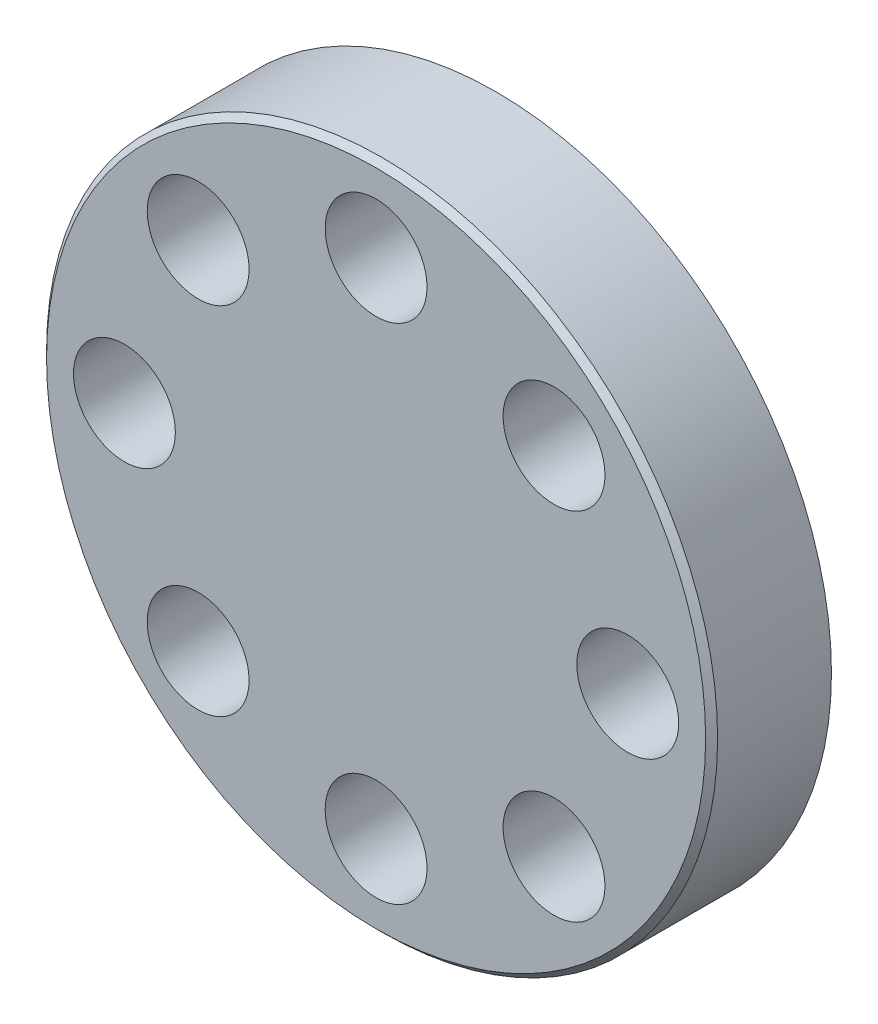
ISO-10303-21;
HEADER;
FILE_DESCRIPTION(('STEP AP214'),'2;1');
FILE_NAME('part.step','',(''),(''),'','','');
FILE_SCHEMA(('AUTOMOTIVE_DESIGN { 1 0 10303 214 1 1 1 1 }'));
ENDSEC;
DATA;
#1=APPLICATION_CONTEXT('core data for automotive mechanical design processes');
#2=APPLICATION_PROTOCOL_DEFINITION('international standard','automotive_design',2000,#1);
#3=PRODUCT_CONTEXT('',#1,'mechanical');
#4=PRODUCT('Part','Part','',(#3));
#5=PRODUCT_RELATED_PRODUCT_CATEGORY('part','',(#4));
#6=PRODUCT_DEFINITION_FORMATION('','',#4);
#7=PRODUCT_DEFINITION_CONTEXT('part definition',#1,'design');
#8=PRODUCT_DEFINITION('design','',#6,#7);
#9=PRODUCT_DEFINITION_SHAPE('','',#8);
#10=(LENGTH_UNIT() NAMED_UNIT(*) SI_UNIT(.MILLI.,.METRE.));
#11=(NAMED_UNIT(*) PLANE_ANGLE_UNIT() SI_UNIT($,.RADIAN.));
#12=(NAMED_UNIT(*) SI_UNIT($,.STERADIAN.) SOLID_ANGLE_UNIT());
#13=UNCERTAINTY_MEASURE_WITH_UNIT(LENGTH_MEASURE(1.E-05),#10,'distance_accuracy_value','');
#14=(GEOMETRIC_REPRESENTATION_CONTEXT(3) GLOBAL_UNCERTAINTY_ASSIGNED_CONTEXT((#13)) GLOBAL_UNIT_ASSIGNED_CONTEXT((#10,
#11,#12)) REPRESENTATION_CONTEXT('',''));
#15=CARTESIAN_POINT('',(0.,0.,0.));
#16=DIRECTION('',(0.,0.,1.));
#17=DIRECTION('',(1.,0.,0.));
#18=AXIS2_PLACEMENT_3D('',#15,#16,#17);
#19=CARTESIAN_POINT('',(0.,0.,10.));
#20=DIRECTION('',(0.,0.,-1.));
#21=DIRECTION('',(-1.,0.,0.));
#22=AXIS2_PLACEMENT_3D('',#19,#20,#21);
#23=CYLINDRICAL_SURFACE('',#22,10.);
#24=CARTESIAN_POINT('',(0.,0.,0.500000000000006));
#25=DIRECTION('',(0.,0.,1.));
#26=DIRECTION('',(1.,0.,0.));
#27=AXIS2_PLACEMENT_3D('',#24,#25,#26);
#28=CIRCLE('',#27,10.);
#29=CARTESIAN_POINT('',(10.,0.,0.500000000000006));
#30=VERTEX_POINT('',#29);
#31=EDGE_CURVE('E52',#30,#30,#28,.T.);
#32=ORIENTED_EDGE('',*,*,#31,.T.);
#33=EDGE_LOOP('',(#32));
#34=FACE_BOUND('',#33,.T.);
#35=CARTESIAN_POINT('',(0.,0.,10.));
#36=DIRECTION('',(0.,0.,1.));
#37=DIRECTION('',(1.,0.,0.));
#38=AXIS2_PLACEMENT_3D('',#35,#36,#37);
#39=CIRCLE('',#38,10.);
#40=CARTESIAN_POINT('',(10.,0.,10.));
#41=VERTEX_POINT('',#40);
#42=EDGE_CURVE('E57',#41,#41,#39,.T.);
#43=ORIENTED_EDGE('',*,*,#42,.F.);
#44=EDGE_LOOP('',(#43));
#45=FACE_BOUND('',#44,.T.);
#46=ADVANCED_FACE('F36',(#34,#45),#23,.T.);
#47=CARTESIAN_POINT('',(0.,0.,0.));
#48=DIRECTION('',(0.,0.,1.));
#49=DIRECTION('',(1.,0.,0.));
#50=AXIS2_PLACEMENT_3D('',#47,#48,#49);
#51=PLANE('',#50);
#52=CARTESIAN_POINT('',(0.,0.,0.));
#53=DIRECTION('',(0.,0.,1.));
#54=DIRECTION('',(1.,0.,0.));
#55=AXIS2_PLACEMENT_3D('',#52,#53,#54);
#56=CIRCLE('',#55,9.49999999999999);
#57=CARTESIAN_POINT('',(9.49999999999999,0.,0.));
#58=VERTEX_POINT('',#57);
#59=EDGE_CURVE('E48',#58,#58,#56,.F.);
#60=ORIENTED_EDGE('',*,*,#59,.T.);
#61=EDGE_LOOP('',(#60));
#62=FACE_BOUND('',#61,.T.);
#63=ADVANCED_FACE('F143',(#62),#51,.F.);
#64=CARTESIAN_POINT('',(0.,0.,20.));
#65=DIRECTION('',(0.,0.,-1.));
#66=DIRECTION('',(-1.,0.,0.));
#67=AXIS2_PLACEMENT_3D('',#64,#65,#66);
#68=CYLINDRICAL_SURFACE('',#67,28.);
#69=CARTESIAN_POINT('',(0.,0.,19.5));
#70=DIRECTION('',(0.,0.,1.));
#71=DIRECTION('',(1.,0.,0.));
#72=AXIS2_PLACEMENT_3D('',#69,#70,#71);
#73=CIRCLE('',#72,28.);
#74=CARTESIAN_POINT('',(28.,0.,19.5));
#75=VERTEX_POINT('',#74);
#76=EDGE_CURVE('E10',#75,#75,#73,.F.);
#77=ORIENTED_EDGE('',*,*,#76,.T.);
#78=EDGE_LOOP('',(#77));
#79=FACE_BOUND('',#78,.T.);
#80=CARTESIAN_POINT('',(0.,0.,10.));
#81=DIRECTION('',(0.,0.,1.));
#82=DIRECTION('',(1.,0.,0.));
#83=AXIS2_PLACEMENT_3D('',#80,#81,#82);
#84=CIRCLE('',#83,28.);
#85=CARTESIAN_POINT('',(28.,0.,10.));
#86=VERTEX_POINT('',#85);
#87=EDGE_CURVE('E84',#86,#86,#84,.T.);
#88=ORIENTED_EDGE('',*,*,#87,.T.);
#89=EDGE_LOOP('',(#88));
#90=FACE_BOUND('',#89,.T.);
#91=ADVANCED_FACE('F119',(#79,#90),#68,.T.);
#92=CARTESIAN_POINT('',(0.,0.,20.));
#93=DIRECTION('',(0.,0.,1.));
#94=DIRECTION('',(1.,0.,0.));
#95=AXIS2_PLACEMENT_3D('',#92,#93,#94);
#96=PLANE('',#95);
#97=CARTESIAN_POINT('',(0.,0.,20.));
#98=DIRECTION('',(0.,0.,1.));
#99=DIRECTION('',(1.,0.,0.));
#100=AXIS2_PLACEMENT_3D('',#97,#98,#99);
#101=CIRCLE('',#100,27.5);
#102=CARTESIAN_POINT('',(27.5,0.,20.));
#103=VERTEX_POINT('',#102);
#104=EDGE_CURVE('E44',#103,#103,#101,.T.);
#105=ORIENTED_EDGE('',*,*,#104,.T.);
#106=EDGE_LOOP('',(#105));
#107=FACE_BOUND('',#106,.T.);
#108=CARTESIAN_POINT('',(-21.,0.,20.));
#109=DIRECTION('',(0.,0.,1.));
#110=DIRECTION('',(0.,1.,0.));
#111=AXIS2_PLACEMENT_3D('',#108,#109,#110);
#112=CIRCLE('',#111,4.25);
#113=CARTESIAN_POINT('',(-21.,4.24999999999993,20.));
#114=VERTEX_POINT('',#113);
#115=EDGE_CURVE('E93',#114,#114,#112,.T.);
#116=ORIENTED_EDGE('',*,*,#115,.F.);
#117=EDGE_LOOP('',(#116));
#118=FACE_BOUND('',#117,.T.);
#119=CARTESIAN_POINT('',(-14.8492424049174,-14.8492424049176,20.));
#120=DIRECTION('',(0.,0.,1.));
#121=DIRECTION('',(-0.707106781186551,0.707106781186544,0.));
#122=AXIS2_PLACEMENT_3D('',#119,#120,#121);
#123=CIRCLE('',#122,4.25);
#124=CARTESIAN_POINT('',(-17.8544462249603,-11.8440385848748,20.));
#125=VERTEX_POINT('',#124);
#126=EDGE_CURVE('E101',#125,#125,#123,.T.);
#127=ORIENTED_EDGE('',*,*,#126,.F.);
#128=EDGE_LOOP('',(#127));
#129=FACE_BOUND('',#128,.T.);
#130=CARTESIAN_POINT('',(0.,-21.,20.));
#131=DIRECTION('',(0.,0.,1.));
#132=DIRECTION('',(-1.,0.,0.));
#133=AXIS2_PLACEMENT_3D('',#130,#131,#132);
#134=CIRCLE('',#133,4.25);
#135=CARTESIAN_POINT('',(-4.25,-21.,20.));
#136=VERTEX_POINT('',#135);
#137=EDGE_CURVE('E97',#136,#136,#134,.T.);
#138=ORIENTED_EDGE('',*,*,#137,.F.);
#139=EDGE_LOOP('',(#138));
#140=FACE_BOUND('',#139,.T.);
#141=CARTESIAN_POINT('',(14.8492424049176,-14.8492424049174,20.));
#142=DIRECTION('',(0.,0.,1.));
#143=DIRECTION('',(-0.707106781186541,-0.707106781186554,0.));
#144=AXIS2_PLACEMENT_3D('',#141,#142,#143);
#145=CIRCLE('',#144,4.25);
#146=CARTESIAN_POINT('',(11.8440385848748,-17.8544462249602,20.));
#147=VERTEX_POINT('',#146);
#148=EDGE_CURVE('E94',#147,#147,#145,.T.);
#149=ORIENTED_EDGE('',*,*,#148,.F.);
#150=EDGE_LOOP('',(#149));
#151=FACE_BOUND('',#150,.T.);
#152=CARTESIAN_POINT('',(21.,2.19963324347117E-13,20.));
#153=DIRECTION('',(0.,0.,1.));
#154=DIRECTION('',(0.,-1.,0.));
#155=AXIS2_PLACEMENT_3D('',#152,#153,#154);
#156=CIRCLE('',#155,4.25);
#157=CARTESIAN_POINT('',(21.,-4.24999999999978,20.));
#158=VERTEX_POINT('',#157);
#159=EDGE_CURVE('E98',#158,#158,#156,.T.);
#160=ORIENTED_EDGE('',*,*,#159,.F.);
#161=EDGE_LOOP('',(#160));
#162=FACE_BOUND('',#161,.T.);
#163=CARTESIAN_POINT('',(14.8492424049173,14.8492424049177,20.));
#164=DIRECTION('',(0.,0.,1.));
#165=DIRECTION('',(0.707106781186556,-0.707106781186539,0.));
#166=AXIS2_PLACEMENT_3D('',#163,#164,#165);
#167=CIRCLE('',#166,4.25);
#168=CARTESIAN_POINT('',(17.8544462249602,11.8440385848749,20.));
#169=VERTEX_POINT('',#168);
#170=EDGE_CURVE('E106',#169,#169,#167,.T.);
#171=ORIENTED_EDGE('',*,*,#170,.F.);
#172=EDGE_LOOP('',(#171));
#173=FACE_BOUND('',#172,.T.);
#174=CARTESIAN_POINT('',(-14.8492424049175,14.8492424049175,20.));
#175=DIRECTION('',(0.,0.,1.));
#176=DIRECTION('',(0.707106781186546,0.707106781186549,0.));
#177=AXIS2_PLACEMENT_3D('',#174,#175,#176);
#178=CIRCLE('',#177,4.25);
#179=CARTESIAN_POINT('',(-11.8440385848747,17.8544462249603,20.));
#180=VERTEX_POINT('',#179);
#181=EDGE_CURVE('E80',#180,#180,#178,.T.);
#182=ORIENTED_EDGE('',*,*,#181,.F.);
#183=EDGE_LOOP('',(#182));
#184=FACE_BOUND('',#183,.T.);
#185=CARTESIAN_POINT('',(0.,21.,20.));
#186=DIRECTION('',(0.,0.,1.));
#187=DIRECTION('',(1.,0.,0.));
#188=AXIS2_PLACEMENT_3D('',#185,#186,#187);
#189=CIRCLE('',#188,4.25);
#190=CARTESIAN_POINT('',(4.25,21.,20.));
#191=VERTEX_POINT('',#190);
#192=EDGE_CURVE('E61',#191,#191,#189,.T.);
#193=ORIENTED_EDGE('',*,*,#192,.F.);
#194=EDGE_LOOP('',(#193));
#195=FACE_BOUND('',#194,.T.);
#196=ADVANCED_FACE('F115',(#107,#118,#129,#140,#151,#162,#173,#184,#195),#96,.T.);
#197=CARTESIAN_POINT('',(0.,0.,10.));
#198=DIRECTION('',(0.,0.,1.));
#199=DIRECTION('',(1.,0.,0.));
#200=AXIS2_PLACEMENT_3D('',#197,#198,#199);
#201=PLANE('',#200);
#202=CARTESIAN_POINT('',(-21.,0.,10.));
#203=DIRECTION('',(0.,0.,1.));
#204=DIRECTION('',(1.,0.,0.));
#205=AXIS2_PLACEMENT_3D('',#202,#203,#204);
#206=CIRCLE('',#205,4.25);
#207=CARTESIAN_POINT('',(-16.75,0.,10.));
#208=VERTEX_POINT('',#207);
#209=EDGE_CURVE('E58',#208,#208,#206,.T.);
#210=ORIENTED_EDGE('',*,*,#209,.T.);
#211=EDGE_LOOP('',(#210));
#212=FACE_BOUND('',#211,.T.);
#213=CARTESIAN_POINT('',(-14.8492424049174,-14.8492424049176,10.));
#214=DIRECTION('',(0.,0.,1.));
#215=DIRECTION('',(1.,0.,0.));
#216=AXIS2_PLACEMENT_3D('',#213,#214,#215);
#217=CIRCLE('',#216,4.25);
#218=CARTESIAN_POINT('',(-10.5992424049174,-14.8492424049176,10.));
#219=VERTEX_POINT('',#218);
#220=EDGE_CURVE('E62',#219,#219,#217,.T.);
#221=ORIENTED_EDGE('',*,*,#220,.T.);
#222=EDGE_LOOP('',(#221));
#223=FACE_BOUND('',#222,.T.);
#224=CARTESIAN_POINT('',(0.,-21.,10.));
#225=DIRECTION('',(0.,0.,1.));
#226=DIRECTION('',(1.,0.,0.));
#227=AXIS2_PLACEMENT_3D('',#224,#225,#226);
#228=CIRCLE('',#227,4.25);
#229=CARTESIAN_POINT('',(4.25,-21.,10.));
#230=VERTEX_POINT('',#229);
#231=EDGE_CURVE('E65',#230,#230,#228,.T.);
#232=ORIENTED_EDGE('',*,*,#231,.T.);
#233=EDGE_LOOP('',(#232));
#234=FACE_BOUND('',#233,.T.);
#235=CARTESIAN_POINT('',(14.8492424049176,-14.8492424049174,10.));
#236=DIRECTION('',(0.,0.,1.));
#237=DIRECTION('',(1.,0.,0.));
#238=AXIS2_PLACEMENT_3D('',#235,#236,#237);
#239=CIRCLE('',#238,4.25);
#240=CARTESIAN_POINT('',(19.0992424049176,-14.8492424049174,10.));
#241=VERTEX_POINT('',#240);
#242=EDGE_CURVE('E68',#241,#241,#239,.T.);
#243=ORIENTED_EDGE('',*,*,#242,.T.);
#244=EDGE_LOOP('',(#243));
#245=FACE_BOUND('',#244,.T.);
#246=CARTESIAN_POINT('',(21.,2.19963324347117E-13,10.));
#247=DIRECTION('',(0.,0.,1.));
#248=DIRECTION('',(1.,0.,0.));
#249=AXIS2_PLACEMENT_3D('',#246,#247,#248);
#250=CIRCLE('',#249,4.25);
#251=CARTESIAN_POINT('',(25.25,2.19963324347117E-13,10.));
#252=VERTEX_POINT('',#251);
#253=EDGE_CURVE('E71',#252,#252,#250,.T.);
#254=ORIENTED_EDGE('',*,*,#253,.T.);
#255=EDGE_LOOP('',(#254));
#256=FACE_BOUND('',#255,.T.);
#257=CARTESIAN_POINT('',(14.8492424049173,14.8492424049177,10.));
#258=DIRECTION('',(0.,0.,1.));
#259=DIRECTION('',(1.,0.,0.));
#260=AXIS2_PLACEMENT_3D('',#257,#258,#259);
#261=CIRCLE('',#260,4.25);
#262=CARTESIAN_POINT('',(19.0992424049173,14.8492424049177,10.));
#263=VERTEX_POINT('',#262);
#264=EDGE_CURVE('E74',#263,#263,#261,.T.);
#265=ORIENTED_EDGE('',*,*,#264,.T.);
#266=EDGE_LOOP('',(#265));
#267=FACE_BOUND('',#266,.T.);
#268=CARTESIAN_POINT('',(-14.8492424049175,14.8492424049175,10.));
#269=DIRECTION('',(0.,0.,1.));
#270=DIRECTION('',(1.,0.,0.));
#271=AXIS2_PLACEMENT_3D('',#268,#269,#270);
#272=CIRCLE('',#271,4.25);
#273=CARTESIAN_POINT('',(-10.5992424049175,14.8492424049175,10.));
#274=VERTEX_POINT('',#273);
#275=EDGE_CURVE('E77',#274,#274,#272,.T.);
#276=ORIENTED_EDGE('',*,*,#275,.T.);
#277=EDGE_LOOP('',(#276));
#278=FACE_BOUND('',#277,.T.);
#279=CARTESIAN_POINT('',(0.,21.,10.));
#280=DIRECTION('',(0.,0.,1.));
#281=DIRECTION('',(1.,0.,0.));
#282=AXIS2_PLACEMENT_3D('',#279,#280,#281);
#283=CIRCLE('',#282,4.25);
#284=CARTESIAN_POINT('',(4.25,21.,10.));
#285=VERTEX_POINT('',#284);
#286=EDGE_CURVE('E81',#285,#285,#283,.T.);
#287=ORIENTED_EDGE('',*,*,#286,.T.);
#288=EDGE_LOOP('',(#287));
#289=FACE_BOUND('',#288,.T.);
#290=ORIENTED_EDGE('',*,*,#42,.T.);
#291=EDGE_LOOP('',(#290));
#292=FACE_BOUND('',#291,.T.);
#293=ORIENTED_EDGE('',*,*,#87,.F.);
#294=EDGE_LOOP('',(#293));
#295=FACE_BOUND('',#294,.T.);
#296=ADVANCED_FACE('F118',(#212,#223,#234,#245,#256,#267,#278,#289,#292,#295),#201,.F.);
#297=CARTESIAN_POINT('',(0.,21.,0.));
#298=DIRECTION('',(0.,0.,1.));
#299=DIRECTION('',(1.,0.,0.));
#300=AXIS2_PLACEMENT_3D('',#297,#298,#299);
#301=CYLINDRICAL_SURFACE('',#300,4.25);
#302=ORIENTED_EDGE('',*,*,#192,.T.);
#303=EDGE_LOOP('',(#302));
#304=FACE_BOUND('',#303,.T.);
#305=ORIENTED_EDGE('',*,*,#286,.F.);
#306=EDGE_LOOP('',(#305));
#307=FACE_BOUND('',#306,.T.);
#308=ADVANCED_FACE('F127',(#304,#307),#301,.F.);
#309=CARTESIAN_POINT('',(-14.8492424049175,14.8492424049175,0.));
#310=DIRECTION('',(0.,0.,1.));
#311=DIRECTION('',(1.,0.,0.));
#312=AXIS2_PLACEMENT_3D('',#309,#310,#311);
#313=CYLINDRICAL_SURFACE('',#312,4.25);
#314=ORIENTED_EDGE('',*,*,#181,.T.);
#315=EDGE_LOOP('',(#314));
#316=FACE_BOUND('',#315,.T.);
#317=ORIENTED_EDGE('',*,*,#275,.F.);
#318=EDGE_LOOP('',(#317));
#319=FACE_BOUND('',#318,.T.);
#320=ADVANCED_FACE('F130',(#316,#319),#313,.F.);
#321=CARTESIAN_POINT('',(14.8492424049173,14.8492424049177,0.));
#322=DIRECTION('',(0.,0.,1.));
#323=DIRECTION('',(1.,0.,0.));
#324=AXIS2_PLACEMENT_3D('',#321,#322,#323);
#325=CYLINDRICAL_SURFACE('',#324,4.25);
#326=ORIENTED_EDGE('',*,*,#170,.T.);
#327=EDGE_LOOP('',(#326));
#328=FACE_BOUND('',#327,.T.);
#329=ORIENTED_EDGE('',*,*,#264,.F.);
#330=EDGE_LOOP('',(#329));
#331=FACE_BOUND('',#330,.T.);
#332=ADVANCED_FACE('F182',(#328,#331),#325,.F.);
#333=CARTESIAN_POINT('',(21.,2.19963324347117E-13,0.));
#334=DIRECTION('',(0.,0.,1.));
#335=DIRECTION('',(1.,0.,0.));
#336=AXIS2_PLACEMENT_3D('',#333,#334,#335);
#337=CYLINDRICAL_SURFACE('',#336,4.25);
#338=ORIENTED_EDGE('',*,*,#159,.T.);
#339=EDGE_LOOP('',(#338));
#340=FACE_BOUND('',#339,.T.);
#341=ORIENTED_EDGE('',*,*,#253,.F.);
#342=EDGE_LOOP('',(#341));
#343=FACE_BOUND('',#342,.T.);
#344=ADVANCED_FACE('F112',(#340,#343),#337,.F.);
#345=CARTESIAN_POINT('',(14.8492424049176,-14.8492424049174,0.));
#346=DIRECTION('',(0.,0.,1.));
#347=DIRECTION('',(1.,0.,0.));
#348=AXIS2_PLACEMENT_3D('',#345,#346,#347);
#349=CYLINDRICAL_SURFACE('',#348,4.25);
#350=ORIENTED_EDGE('',*,*,#148,.T.);
#351=EDGE_LOOP('',(#350));
#352=FACE_BOUND('',#351,.T.);
#353=ORIENTED_EDGE('',*,*,#242,.F.);
#354=EDGE_LOOP('',(#353));
#355=FACE_BOUND('',#354,.T.);
#356=ADVANCED_FACE('F187',(#352,#355),#349,.F.);
#357=CARTESIAN_POINT('',(0.,-21.,0.));
#358=DIRECTION('',(0.,0.,1.));
#359=DIRECTION('',(1.,0.,0.));
#360=AXIS2_PLACEMENT_3D('',#357,#358,#359);
#361=CYLINDRICAL_SURFACE('',#360,4.25);
#362=ORIENTED_EDGE('',*,*,#137,.T.);
#363=EDGE_LOOP('',(#362));
#364=FACE_BOUND('',#363,.T.);
#365=ORIENTED_EDGE('',*,*,#231,.F.);
#366=EDGE_LOOP('',(#365));
#367=FACE_BOUND('',#366,.T.);
#368=ADVANCED_FACE('F177',(#364,#367),#361,.F.);
#369=CARTESIAN_POINT('',(-14.8492424049174,-14.8492424049176,0.));
#370=DIRECTION('',(0.,0.,1.));
#371=DIRECTION('',(1.,0.,0.));
#372=AXIS2_PLACEMENT_3D('',#369,#370,#371);
#373=CYLINDRICAL_SURFACE('',#372,4.25);
#374=ORIENTED_EDGE('',*,*,#126,.T.);
#375=EDGE_LOOP('',(#374));
#376=FACE_BOUND('',#375,.T.);
#377=ORIENTED_EDGE('',*,*,#220,.F.);
#378=EDGE_LOOP('',(#377));
#379=FACE_BOUND('',#378,.T.);
#380=ADVANCED_FACE('F168',(#376,#379),#373,.F.);
#381=CARTESIAN_POINT('',(-21.,0.,0.));
#382=DIRECTION('',(0.,0.,1.));
#383=DIRECTION('',(1.,0.,0.));
#384=AXIS2_PLACEMENT_3D('',#381,#382,#383);
#385=CYLINDRICAL_SURFACE('',#384,4.25);
#386=ORIENTED_EDGE('',*,*,#115,.T.);
#387=EDGE_LOOP('',(#386));
#388=FACE_BOUND('',#387,.T.);
#389=ORIENTED_EDGE('',*,*,#209,.F.);
#390=EDGE_LOOP('',(#389));
#391=FACE_BOUND('',#390,.T.);
#392=ADVANCED_FACE('F161',(#388,#391),#385,.F.);
#393=CARTESIAN_POINT('',(0.,0.,0.500000000000006));
#394=DIRECTION('',(0.,0.,1.));
#395=DIRECTION('',(1.,0.,0.));
#396=AXIS2_PLACEMENT_3D('',#393,#394,#395);
#397=CONICAL_SURFACE('',#396,10.,0.785398163397448);
#398=ORIENTED_EDGE('',*,*,#59,.F.);
#399=EDGE_LOOP('',(#398));
#400=FACE_BOUND('',#399,.T.);
#401=ORIENTED_EDGE('',*,*,#31,.F.);
#402=EDGE_LOOP('',(#401));
#403=FACE_BOUND('',#402,.T.);
#404=ADVANCED_FACE('F157',(#400,#403),#397,.T.);
#405=CARTESIAN_POINT('',(0.,0.,20.));
#406=DIRECTION('',(0.,0.,-1.));
#407=DIRECTION('',(-1.,0.,0.));
#408=AXIS2_PLACEMENT_3D('',#405,#406,#407);
#409=CONICAL_SURFACE('',#408,27.5,0.785398163397445);
#410=ORIENTED_EDGE('',*,*,#76,.F.);
#411=EDGE_LOOP('',(#410));
#412=FACE_BOUND('',#411,.T.);
#413=ORIENTED_EDGE('',*,*,#104,.F.);
#414=EDGE_LOOP('',(#413));
#415=FACE_BOUND('',#414,.T.);
#416=ADVANCED_FACE('F39',(#412,#415),#409,.T.);
#417=CLOSED_SHELL('',(#46,#63,#91,#196,#296,#308,#320,#332,#344,#356,#368,#380,#392,#404,#416));
#418=MANIFOLD_SOLID_BREP('B2',#417);
#419=ADVANCED_BREP_SHAPE_REPRESENTATION('',(#18,#418),#14);
#420=SHAPE_DEFINITION_REPRESENTATION(#9,#419);
ENDSEC;
END-ISO-10303-21;
